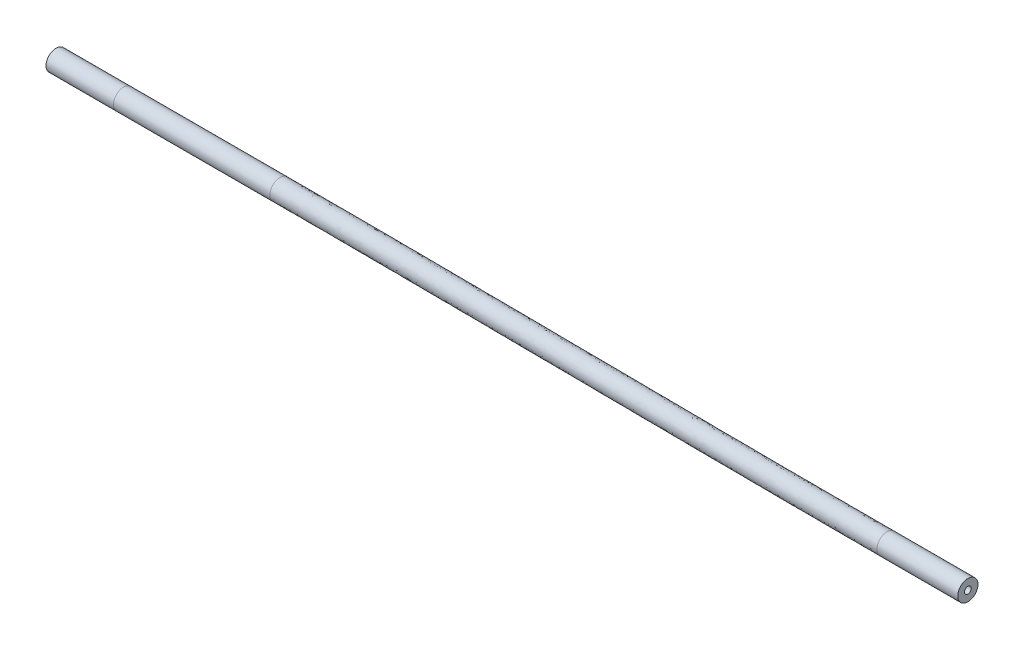
ISO-10303-21;
HEADER;
FILE_DESCRIPTION(('STEP AP214'),'2;1');
FILE_NAME('part.step','',(''),(''),'','','');
FILE_SCHEMA(('AUTOMOTIVE_DESIGN { 1 0 10303 214 1 1 1 1 }'));
ENDSEC;
DATA;
#1=APPLICATION_CONTEXT('core data for automotive mechanical design processes');
#2=APPLICATION_PROTOCOL_DEFINITION('international standard','automotive_design',2000,#1);
#3=PRODUCT_CONTEXT('',#1,'mechanical');
#4=PRODUCT('Part','Part','',(#3));
#5=PRODUCT_RELATED_PRODUCT_CATEGORY('part','',(#4));
#6=PRODUCT_DEFINITION_FORMATION('','',#4);
#7=PRODUCT_DEFINITION_CONTEXT('part definition',#1,'design');
#8=PRODUCT_DEFINITION('design','',#6,#7);
#9=PRODUCT_DEFINITION_SHAPE('','',#8);
#10=(LENGTH_UNIT() NAMED_UNIT(*) SI_UNIT(.MILLI.,.METRE.));
#11=(NAMED_UNIT(*) PLANE_ANGLE_UNIT() SI_UNIT($,.RADIAN.));
#12=(NAMED_UNIT(*) SI_UNIT($,.STERADIAN.) SOLID_ANGLE_UNIT());
#13=UNCERTAINTY_MEASURE_WITH_UNIT(LENGTH_MEASURE(1.E-05),#10,'distance_accuracy_value','');
#14=(GEOMETRIC_REPRESENTATION_CONTEXT(3) GLOBAL_UNCERTAINTY_ASSIGNED_CONTEXT((#13)) GLOBAL_UNIT_ASSIGNED_CONTEXT((#10,
#11,#12)) REPRESENTATION_CONTEXT('',''));
#15=CARTESIAN_POINT('',(0.,0.,0.));
#16=DIRECTION('',(0.,0.,1.));
#17=DIRECTION('',(1.,0.,0.));
#18=AXIS2_PLACEMENT_3D('',#15,#16,#17);
#19=CARTESIAN_POINT('',(114.,-0.499999999999999,0.));
#20=DIRECTION('',(-1.,0.,0.));
#21=DIRECTION('',(0.,-1.,0.));
#22=AXIS2_PLACEMENT_3D('',#19,#20,#21);
#23=CYLINDRICAL_SURFACE('',#22,1.5);
#24=CARTESIAN_POINT('',(102.,-0.499999999999996,0.));
#25=DIRECTION('',(1.,0.,0.));
#26=DIRECTION('',(0.,0.,-1.));
#27=AXIS2_PLACEMENT_3D('',#24,#25,#26);
#28=CIRCLE('',#27,1.5);
#29=CARTESIAN_POINT('',(102.,-0.499999999999996,-1.5));
#30=VERTEX_POINT('',#29);
#31=EDGE_CURVE('E64',#30,#30,#28,.T.);
#32=ORIENTED_EDGE('',*,*,#31,.T.);
#33=EDGE_LOOP('',(#32));
#34=FACE_BOUND('',#33,.T.);
#35=CARTESIAN_POINT('',(114.,-0.499999999999999,0.));
#36=DIRECTION('',(1.,0.,0.));
#37=DIRECTION('',(0.,0.,-1.));
#38=AXIS2_PLACEMENT_3D('',#35,#36,#37);
#39=CIRCLE('',#38,1.5);
#40=CARTESIAN_POINT('',(114.,-0.499999999999999,-1.5));
#41=VERTEX_POINT('',#40);
#42=EDGE_CURVE('E60',#41,#41,#39,.T.);
#43=ORIENTED_EDGE('',*,*,#42,.F.);
#44=EDGE_LOOP('',(#43));
#45=FACE_BOUND('',#44,.T.);
#46=ADVANCED_FACE('F38',(#34,#45),#23,.T.);
#47=CARTESIAN_POINT('',(102.,-0.499999999999996,-1.5));
#48=CARTESIAN_POINT('',(86.9995138723806,-0.499999999999995,-1.5));
#49=CARTESIAN_POINT('',(71.9996527699958,-0.374999999980908,-1.5));
#50=CARTESIAN_POINT('',(42.0003472300039,-0.125000000019079,-1.5));
#51=CARTESIAN_POINT('',(27.0004861276194,0.,-1.5));
#52=CARTESIAN_POINT('',(12.,0.,-1.5));
#53=CARTESIAN_POINT('',(102.,2.50000000000001,-1.5));
#54=CARTESIAN_POINT('',(87.0078468199204,2.50000000000001,-1.5));
#55=CARTESIAN_POINT('',(72.0246524806557,2.62489583395516,-1.5));
#56=CARTESIAN_POINT('',(42.0253469406638,2.87489583391699,-1.5));
#57=CARTESIAN_POINT('',(27.0088190751592,3.00000000000001,-1.5));
#58=CARTESIAN_POINT('',(12.,3.00000000000001,-1.5));
#59=CARTESIAN_POINT('',(102.,2.50000000000001,1.5));
#60=CARTESIAN_POINT('',(87.0078468199204,2.50000000000001,1.5));
#61=CARTESIAN_POINT('',(72.0246524806557,2.62489583395557,1.5));
#62=CARTESIAN_POINT('',(42.0253469406638,2.87489583391658,1.5));
#63=CARTESIAN_POINT('',(27.0088190751592,3.00000000000001,1.5));
#64=CARTESIAN_POINT('',(12.,3.00000000000001,1.5));
#65=CARTESIAN_POINT('',(102.,-0.499999999999996,1.5));
#66=CARTESIAN_POINT('',(86.9995138723806,-0.499999999999995,1.5));
#67=CARTESIAN_POINT('',(71.9996527699958,-0.374999999980501,1.5));
#68=CARTESIAN_POINT('',(42.0003472300039,-0.125000000019485,1.5));
#69=CARTESIAN_POINT('',(27.0004861276194,0.,1.5));
#70=CARTESIAN_POINT('',(12.,0.,1.5));
#71=CARTESIAN_POINT('',(102.,-3.5,1.5));
#72=CARTESIAN_POINT('',(86.9911809248408,-3.5,1.5));
#73=CARTESIAN_POINT('',(71.9746530593359,-3.37489583391657,1.5));
#74=CARTESIAN_POINT('',(41.975347519344,-3.12489583395555,1.5));
#75=CARTESIAN_POINT('',(26.9921531800796,-3.00000000000001,1.5));
#76=CARTESIAN_POINT('',(12.,-3.00000000000001,1.5));
#77=CARTESIAN_POINT('',(102.,-3.5,-1.5));
#78=CARTESIAN_POINT('',(86.9911809248408,-3.5,-1.5));
#79=CARTESIAN_POINT('',(71.9746530593359,-3.37489583391697,-1.5));
#80=CARTESIAN_POINT('',(41.975347519344,-3.12489583395515,-1.5));
#81=CARTESIAN_POINT('',(26.9921531800796,-3.00000000000001,-1.5));
#82=CARTESIAN_POINT('',(12.,-3.00000000000001,-1.5));
#83=CARTESIAN_POINT('',(102.,-0.499999999999996,-1.5));
#84=CARTESIAN_POINT('',(86.9995138723806,-0.499999999999995,-1.5));
#85=CARTESIAN_POINT('',(71.9996527699958,-0.374999999980908,-1.5));
#86=CARTESIAN_POINT('',(42.0003472300039,-0.125000000019079,-1.5));
#87=CARTESIAN_POINT('',(27.0004861276194,0.,-1.5));
#88=CARTESIAN_POINT('',(12.,0.,-1.5));
#89=(BOUNDED_SURFACE() B_SPLINE_SURFACE(3,3,((#47,#48,#49,#50,#51,#52),(#53,#54,#55,#56,#57,
#58),(#59,#60,#61,#62,#63,#64),(#65,#66,#67,#68,#69,#70),(#71,#72,#73,#74,#75,#76),(#77,#78,#79,
#80,#81,#82),(#83,#84,#85,#86,#87,#88)),.UNSPECIFIED.,.T.,.F.,
.F.) B_SPLINE_SURFACE_WITH_KNOTS((4,3,4),(4,2,4),(0.,0.5,1.),(0.088756302247101,
0.421598599681728,0.754440897116355),
.UNSPECIFIED.) GEOMETRIC_REPRESENTATION_ITEM() RATIONAL_B_SPLINE_SURFACE(((1.,1.,1.,1.,1.,1.),
(0.333333333333333,0.333333333333333,0.333333333333333,0.333333333333333,0.333333333333333,
0.333333333333333),(0.333333333333333,0.333333333333333,0.333333333333333,0.333333333333333,
0.333333333333333,0.333333333333333),(1.,1.,1.,1.,1.,1.),(0.333333333333333,0.333333333333333,
0.333333333333333,0.333333333333333,0.333333333333333,0.333333333333333),(0.333333333333333,
0.333333333333333,0.333333333333333,0.333333333333333,0.333333333333333,0.333333333333333),(1.,
1.,1.,1.,1.,1.))) REPRESENTATION_ITEM('') SURFACE());
#90=CARTESIAN_POINT('',(12.,0.,0.));
#91=DIRECTION('',(1.,0.,0.));
#92=DIRECTION('',(0.,0.,-1.));
#93=AXIS2_PLACEMENT_3D('',#90,#91,#92);
#94=CIRCLE('',#93,1.5);
#95=CARTESIAN_POINT('',(12.,0.,-1.5));
#96=VERTEX_POINT('',#95);
#97=EDGE_CURVE('E61',#96,#96,#94,.T.);
#98=CARTESIAN_POINT('',(12.,0.,-1.5));
#99=CARTESIAN_POINT('',(12.9375281718332,9.66908971677786E-10,-1.5));
#100=CARTESIAN_POINT('',(13.8750562774701,-0.000488278927976679,-1.5));
#101=CARTESIAN_POINT('',(15.7501078091922,-0.00238036961634652,-1.5));
#102=CARTESIAN_POINT('',(16.6876312352812,-0.00378417673254461,-1.5));
#103=CARTESIAN_POINT('',(18.5626735755728,-0.00744628651826532,-1.5));
#104=CARTESIAN_POINT('',(19.5001924897805,-0.00970458662074905,-1.5));
#105=CARTESIAN_POINT('',(21.3752260218824,-0.0150146459030774,-1.5));
#106=CARTESIAN_POINT('',(22.3127406397814,-0.0180664033613219,-1.5));
#107=CARTESIAN_POINT('',(24.1877657820036,-0.0249023415150378,-1.5));
#108=CARTESIAN_POINT('',(25.1252763063309,-0.028686521111428,-1.5));
#109=CARTESIAN_POINT('',(27.0002934675876,-0.0369262678108394,-1.5));
#110=CARTESIAN_POINT('',(27.93780010452,-0.0413818342531771,-1.5));
#111=CARTESIAN_POINT('',(29.8128096962432,-0.0509033191153537,-1.5));
#112=CARTESIAN_POINT('',(30.7503126510361,-0.0559692371644817,-1.5));
#113=CARTESIAN_POINT('',(32.6253150839835,-0.0666503898430166,-1.5));
#114=CARTESIAN_POINT('',(33.5628145621393,-0.0722656242758549,-1.5));
#115=CARTESIAN_POINT('',(35.4378102472496,-0.0839843744332726,-1.5));
#116=CARTESIAN_POINT('',(36.3753064542047,-0.0900878900490866,-1.5));
#117=CARTESIAN_POINT('',(38.2502958023677,-0.102722167364138,-1.5));
#118=CARTESIAN_POINT('',(39.1877889435762,-0.109252928982462,-1.5));
#119=CARTESIAN_POINT('',(41.0627723656951,-0.122680663139223,-1.5));
#120=CARTESIAN_POINT('',(42.0002626466061,-0.129577635587928,-1.5));
#121=CARTESIAN_POINT('',(43.8752405535802,-0.1436767563028,-1.5));
#122=CARTESIAN_POINT('',(44.8127281796441,-0.150878904453925,-1.5));
#123=CARTESIAN_POINT('',(46.6877009823743,-0.165527341369215,-1.5));
#124=CARTESIAN_POINT('',(47.6251861590416,-0.172973629993612,-1.5));
#125=CARTESIAN_POINT('',(49.5001542684259,-0.188049313066894,-1.5));
#126=CARTESIAN_POINT('',(50.4376372011439,-0.195678707365836,-1.5));
#127=CARTESIAN_POINT('',(52.3126010280898,-0.211059565409626,-1.5));
#128=CARTESIAN_POINT('',(53.2500819223187,-0.218811029019776,-1.5));
#129=CARTESIAN_POINT('',(55.1250418776979,-0.234374995144138,-1.5));
#130=CARTESIAN_POINT('',(56.0625209388489,-0.242187497572066,-1.5));
#131=CARTESIAN_POINT('',(57.9374790611508,-0.257812502427921,-1.5));
#132=CARTESIAN_POINT('',(58.8749581223018,-0.265625004855848,-1.5));
#133=CARTESIAN_POINT('',(60.749918077681,-0.281188970980211,-1.5));
#134=CARTESIAN_POINT('',(61.6873989719099,-0.288940434590361,-1.5));
#135=CARTESIAN_POINT('',(63.5623627988558,-0.304321292634152,-1.5));
#136=CARTESIAN_POINT('',(64.4998457315739,-0.311950686933093,-1.5));
#137=CARTESIAN_POINT('',(66.3748138409581,-0.327026370006375,-1.5));
#138=CARTESIAN_POINT('',(67.3122990176255,-0.334472658630773,-1.5));
#139=CARTESIAN_POINT('',(69.1872718203557,-0.349121095546064,-1.5));
#140=CARTESIAN_POINT('',(70.1247594464195,-0.356323243697189,-1.5));
#141=CARTESIAN_POINT('',(71.9997373533937,-0.370422364412061,-1.5));
#142=CARTESIAN_POINT('',(72.9372276343047,-0.377319336860766,-1.5));
#143=CARTESIAN_POINT('',(74.8122110564236,-0.390747071017528,-1.5));
#144=CARTESIAN_POINT('',(75.7497041976321,-0.397277832635852,-1.5));
#145=CARTESIAN_POINT('',(77.6246935457952,-0.409912109950904,-1.5));
#146=CARTESIAN_POINT('',(78.5621897527503,-0.416015625566719,-1.5));
#147=CARTESIAN_POINT('',(80.4371854378605,-0.427734375724137,-1.5));
#148=CARTESIAN_POINT('',(81.3746849160163,-0.433349610156975,-1.5));
#149=CARTESIAN_POINT('',(83.2496873489638,-0.444030762835511,-1.5));
#150=CARTESIAN_POINT('',(84.1871903037567,-0.449096680884639,-1.5));
#151=CARTESIAN_POINT('',(86.06219989548,-0.458618165746817,-1.5));
#152=CARTESIAN_POINT('',(86.9997065324123,-0.463073732189154,-1.5));
#153=CARTESIAN_POINT('',(88.874723693669,-0.471313478888567,-1.5));
#154=CARTESIAN_POINT('',(89.8122342179963,-0.475097658484957,-1.5));
#155=CARTESIAN_POINT('',(91.6872593602186,-0.481933596638673,-1.5));
#156=CARTESIAN_POINT('',(92.6247739781176,-0.484985354096918,-1.5));
#157=CARTESIAN_POINT('',(94.4998075102194,-0.490295413379247,-1.5));
#158=CARTESIAN_POINT('',(95.4373264244272,-0.492553713481731,-1.5));
#159=CARTESIAN_POINT('',(97.3123687647188,-0.496215823267452,-1.5));
#160=CARTESIAN_POINT('',(98.2498921908078,-0.49761963038365,-1.5));
#161=CARTESIAN_POINT('',(100.12494372253,-0.49951172107202,-1.5));
#162=CARTESIAN_POINT('',(101.062471828167,-0.500000000966906,-1.5));
#163=CARTESIAN_POINT('',(102.,-0.499999999999996,-1.5));
#164=B_SPLINE_CURVE_WITH_KNOTS('',3,(#98,#99,#100,#101,#102,#103,#104,#105,#106,#107,#108,#109,
#110,#111,#112,#113,#114,#115,#116,#117,#118,#119,#120,#121,#122,#123,#124,#125,#126,#127,#128,
#129,#130,#131,#132,#133,#134,#135,#136,#137,#138,#139,#140,#141,#142,#143,#144,#145,#146,#147,
#148,#149,#150,#151,#152,#153,#154,#155,#156,#157,#158,#159,#160,#161,#162,#163),.UNSPECIFIED.,
.F.,.F.,(4,2,2,2,2,2,2,2,2,2,2,2,2,2,2,2,2,2,2,2,2,2,2,2,2,2,2,2,2,2,2,2,4),(0.,
2.81258429187561,5.62515728685783,8.4377218324706,11.2502802755861,14.0628344981763,
16.8753859530682,19.6879356997016,22.5004844398898,25.3130325535802,28.1255801346169,
30.9381270265026,33.7506728581613,36.5632170797,39.3757589981712,42.1882978133345,
45.000832653418,47.8133674935015,50.6259063086648,53.438448227136,56.2509924486748,
59.0635382803334,61.8760851722192,64.6886327532559,67.5011808669463,70.3137296071345,
73.126279353768,75.9388308086599,78.7513850312501,81.5639434743656,84.3765080199784,
87.1890810149607,90.0016653068362),.UNSPECIFIED.);
#165=EDGE_CURVE('BSEAM115',#96,#30,#164,.T.);
#166=ORIENTED_EDGE('',*,*,#97,.T.);
#167=ORIENTED_EDGE('',*,*,#31,.F.);
#168=ORIENTED_EDGE('',*,*,#165,.T.);
#169=ORIENTED_EDGE('',*,*,#165,.F.);
#170=EDGE_LOOP('',(#166,#168,#167,#169));
#171=FACE_BOUND('',#170,.T.);
#172=ADVANCED_FACE('F115',(#171),#89,.F.);
#173=CARTESIAN_POINT('',(12.,0.,0.));
#174=DIRECTION('',(-1.,0.,0.));
#175=DIRECTION('',(0.,0.,1.));
#176=AXIS2_PLACEMENT_3D('',#173,#174,#175);
#177=CYLINDRICAL_SURFACE('',#176,1.5);
#178=CARTESIAN_POINT('',(-11.2,0.,0.));
#179=DIRECTION('',(1.,0.,0.));
#180=DIRECTION('',(0.,0.,-1.));
#181=AXIS2_PLACEMENT_3D('',#178,#179,#180);
#182=CIRCLE('',#181,1.5);
#183=CARTESIAN_POINT('',(-11.2,0.,-1.5));
#184=VERTEX_POINT('',#183);
#185=EDGE_CURVE('E57',#184,#184,#182,.T.);
#186=ORIENTED_EDGE('',*,*,#185,.T.);
#187=EDGE_LOOP('',(#186));
#188=FACE_BOUND('',#187,.T.);
#189=ORIENTED_EDGE('',*,*,#97,.F.);
#190=EDGE_LOOP('',(#189));
#191=FACE_BOUND('',#190,.T.);
#192=ADVANCED_FACE('F121',(#188,#191),#177,.T.);
#193=CARTESIAN_POINT('',(-11.2,0.,0.));
#194=DIRECTION('',(-1.,0.,0.));
#195=DIRECTION('',(0.,-1.,0.));
#196=AXIS2_PLACEMENT_3D('',#193,#194,#195);
#197=CYLINDRICAL_SURFACE('',#196,1.5);
#198=CARTESIAN_POINT('',(-21.2,0.,0.));
#199=DIRECTION('',(1.,0.,0.));
#200=DIRECTION('',(0.,0.,-1.));
#201=AXIS2_PLACEMENT_3D('',#198,#199,#200);
#202=CIRCLE('',#201,1.5);
#203=CARTESIAN_POINT('',(-21.2,0.,-1.5));
#204=VERTEX_POINT('',#203);
#205=EDGE_CURVE('E69',#204,#204,#202,.T.);
#206=ORIENTED_EDGE('',*,*,#205,.T.);
#207=EDGE_LOOP('',(#206));
#208=FACE_BOUND('',#207,.T.);
#209=ORIENTED_EDGE('',*,*,#185,.F.);
#210=EDGE_LOOP('',(#209));
#211=FACE_BOUND('',#210,.T.);
#212=ADVANCED_FACE('F112',(#208,#211),#197,.T.);
#213=CARTESIAN_POINT('',(114.,-0.499999999999999,0.));
#214=DIRECTION('',(1.,0.,0.));
#215=DIRECTION('',(0.,0.,-1.));
#216=AXIS2_PLACEMENT_3D('',#213,#214,#215);
#217=PLANE('',#216);
#218=CARTESIAN_POINT('',(114.,-0.499999999999999,0.));
#219=DIRECTION('',(1.,0.,0.));
#220=DIRECTION('',(0.,0.,-1.));
#221=AXIS2_PLACEMENT_3D('',#218,#219,#220);
#222=CIRCLE('',#221,0.5);
#223=CARTESIAN_POINT('',(114.,-0.499999999999999,-0.5));
#224=VERTEX_POINT('',#223);
#225=EDGE_CURVE('E71',#224,#224,#222,.F.);
#226=ORIENTED_EDGE('',*,*,#225,.T.);
#227=EDGE_LOOP('',(#226));
#228=FACE_BOUND('',#227,.T.);
#229=ORIENTED_EDGE('',*,*,#42,.T.);
#230=EDGE_LOOP('',(#229));
#231=FACE_BOUND('',#230,.T.);
#232=ADVANCED_FACE('F81',(#228,#231),#217,.T.);
#233=CARTESIAN_POINT('',(-21.2,0.,0.));
#234=DIRECTION('',(1.,0.,0.));
#235=DIRECTION('',(0.,0.,-1.));
#236=AXIS2_PLACEMENT_3D('',#233,#234,#235);
#237=PLANE('',#236);
#238=CARTESIAN_POINT('',(-21.2,0.,0.));
#239=DIRECTION('',(1.,0.,0.));
#240=DIRECTION('',(0.,0.,-1.));
#241=AXIS2_PLACEMENT_3D('',#238,#239,#240);
#242=CIRCLE('',#241,1.30000000000001);
#243=CARTESIAN_POINT('',(-21.2,-1.30000000000001,0.));
#244=VERTEX_POINT('',#243);
#245=EDGE_CURVE('E10',#244,#244,#242,.T.);
#246=ORIENTED_EDGE('',*,*,#245,.T.);
#247=EDGE_LOOP('',(#246));
#248=FACE_BOUND('',#247,.T.);
#249=ORIENTED_EDGE('',*,*,#205,.F.);
#250=EDGE_LOOP('',(#249));
#251=FACE_BOUND('',#250,.T.);
#252=ADVANCED_FACE('F87',(#248,#251),#237,.F.);
#253=CARTESIAN_POINT('',(114.,-0.499999999999999,0.));
#254=DIRECTION('',(-1.,0.,0.));
#255=DIRECTION('',(0.,-1.,0.));
#256=AXIS2_PLACEMENT_3D('',#253,#254,#255);
#257=CYLINDRICAL_SURFACE('',#256,0.5);
#258=CARTESIAN_POINT('',(102.,-0.499999999999996,0.));
#259=DIRECTION('',(1.,0.,0.));
#260=DIRECTION('',(0.,0.,-1.));
#261=AXIS2_PLACEMENT_3D('',#258,#259,#260);
#262=CIRCLE('',#261,0.5);
#263=CARTESIAN_POINT('',(102.,-0.499999999999996,-0.5));
#264=VERTEX_POINT('',#263);
#265=EDGE_CURVE('E75',#264,#264,#262,.F.);
#266=ORIENTED_EDGE('',*,*,#265,.T.);
#267=EDGE_LOOP('',(#266));
#268=FACE_BOUND('',#267,.T.);
#269=ORIENTED_EDGE('',*,*,#225,.F.);
#270=EDGE_LOOP('',(#269));
#271=FACE_BOUND('',#270,.T.);
#272=ADVANCED_FACE('F84',(#268,#271),#257,.F.);
#273=CARTESIAN_POINT('',(102.,-0.499999999999996,-0.5));
#274=CARTESIAN_POINT('',(71.9990277447612,-0.499999999999994,-0.5));
#275=CARTESIAN_POINT('',(42.0009722552388,0.,-0.5));
#276=CARTESIAN_POINT('',(12.,0.,-0.5));
#277=CARTESIAN_POINT('',(102.,-1.5,-0.5));
#278=CARTESIAN_POINT('',(71.9934724464014,-1.49999999999999,-0.5));
#279=CARTESIAN_POINT('',(41.9954169568789,-1.,-0.5));
#280=CARTESIAN_POINT('',(12.,-1.,-0.5));
#281=CARTESIAN_POINT('',(102.,-1.5,0.5));
#282=CARTESIAN_POINT('',(71.9934724464014,-1.49999999999999,0.5));
#283=CARTESIAN_POINT('',(41.9954169568789,-1.,0.5));
#284=CARTESIAN_POINT('',(12.,-1.,0.5));
#285=CARTESIAN_POINT('',(102.,-0.499999999999996,0.5));
#286=CARTESIAN_POINT('',(71.9990277447612,-0.499999999999993,0.5));
#287=CARTESIAN_POINT('',(42.0009722552388,0.,0.5));
#288=CARTESIAN_POINT('',(12.,0.,0.5));
#289=CARTESIAN_POINT('',(102.,0.500000000000004,0.5));
#290=CARTESIAN_POINT('',(72.0045830431211,0.500000000000006,0.5));
#291=CARTESIAN_POINT('',(42.0065275535986,0.999999999999999,0.5));
#292=CARTESIAN_POINT('',(12.,0.999999999999999,0.5));
#293=CARTESIAN_POINT('',(102.,0.500000000000004,-0.5));
#294=CARTESIAN_POINT('',(72.0045830431211,0.500000000000006,-0.5));
#295=CARTESIAN_POINT('',(42.0065275535986,0.999999999999999,-0.5));
#296=CARTESIAN_POINT('',(12.,0.999999999999999,-0.5));
#297=CARTESIAN_POINT('',(102.,-0.499999999999996,-0.5));
#298=CARTESIAN_POINT('',(71.9990277447612,-0.499999999999994,-0.5));
#299=CARTESIAN_POINT('',(42.0009722552388,0.,-0.5));
#300=CARTESIAN_POINT('',(12.,0.,-0.5));
#301=(BOUNDED_SURFACE() B_SPLINE_SURFACE(3,3,((#273,#274,#275,#276),(#277,#278,#279,#280),(#281,
#282,#283,#284),(#285,#286,#287,#288),(#289,#290,#291,#292),(#293,#294,#295,#296),(#297,#298,
#299,#300)),.UNSPECIFIED.,.T.,.F.,.F.) B_SPLINE_SURFACE_WITH_KNOTS((4,3,4),(4,4),(0.,0.5,1.),
(0.088756302247101,0.754440897116355),
.UNSPECIFIED.) GEOMETRIC_REPRESENTATION_ITEM() RATIONAL_B_SPLINE_SURFACE(((1.,1.,1.,1.),
(0.333333333333333,0.333333333333333,0.333333333333333,0.333333333333333),(0.333333333333333,
0.333333333333333,0.333333333333333,0.333333333333333),(1.,1.,1.,1.),(0.333333333333333,
0.333333333333333,0.333333333333333,0.333333333333333),(0.333333333333333,0.333333333333333,
0.333333333333333,0.333333333333333),(1.,1.,1.,1.))) REPRESENTATION_ITEM('') SURFACE());
#302=CARTESIAN_POINT('',(12.,0.,0.));
#303=DIRECTION('',(1.,0.,0.));
#304=DIRECTION('',(0.,0.,-1.));
#305=AXIS2_PLACEMENT_3D('',#302,#303,#304);
#306=CIRCLE('',#305,0.5);
#307=CARTESIAN_POINT('',(12.,0.,-0.5));
#308=VERTEX_POINT('',#307);
#309=EDGE_CURVE('E54',#308,#308,#306,.F.);
#310=CARTESIAN_POINT('',(12.,0.,-0.5));
#311=CARTESIAN_POINT('',(12.9375277903645,1.12084924024294E-09,-0.5));
#312=CARTESIAN_POINT('',(13.8750555145343,-0.000488278528079691,-0.5));
#313=CARTESIAN_POINT('',(15.7501056221102,-0.0023803693486022,-0.5));
#314=CARTESIAN_POINT('',(16.6876280055207,-0.00378417619720582,-0.5));
#315=CARTESIAN_POINT('',(18.5626677518305,-0.00744628605865432,-0.5));
#316=CARTESIAN_POINT('',(19.5001851147359,-0.00970458604087341,-0.5));
#317=CARTESIAN_POINT('',(21.375215188195,-0.0150146454714009,-0.5));
#318=CARTESIAN_POINT('',(22.3127278987545,-0.0180664028967783,-0.5));
#319=CARTESIAN_POINT('',(24.1877490228472,-0.0249023412324999,-0.5));
#320=CARTESIAN_POINT('',(25.1252574363849,-0.0286865208848214,-0.5));
#321=CARTESIAN_POINT('',(27.0002703251993,-0.03692626780627,-0.5));
#322=CARTESIAN_POINT('',(27.9377748004791,-0.0413818343782925,-0.5));
#323=CARTESIAN_POINT('',(29.8127801706218,-0.0509033194967627,-0.5));
#324=CARTESIAN_POINT('',(30.7502810654862,-0.0559692377387291,-0.5));
#325=CARTESIAN_POINT('',(32.6252796328891,-0.0666503907051491,-0.5));
#326=CARTESIAN_POINT('',(33.5627773054279,-0.0722656253820444,-0.5));
#327=CARTESIAN_POINT('',(35.437769786204,-0.0839843758558361,-0.5));
#328=CARTESIAN_POINT('',(36.3752645944407,-0.090087891755889,-0.5));
#329=CARTESIAN_POINT('',(38.2502517046546,-0.102722169411344,-0.5));
#330=CARTESIAN_POINT('',(39.1877440066307,-0.109252931340798,-0.5));
#331=CARTESIAN_POINT('',(41.06272646236,-0.122680665863401,-0.5));
#332=CARTESIAN_POINT('',(42.0002166161119,-0.129577638644961,-0.5));
#333=CARTESIAN_POINT('',(43.8751951334306,-0.143676759730408,-0.5));
#334=CARTESIAN_POINT('',(44.8126834969962,-0.150878908200705,-0.5));
#335=CARTESIAN_POINT('',(46.6876587919794,-0.165527345553195,-0.5));
#336=CARTESIAN_POINT('',(47.6251457233959,-0.172973634560516,-0.5));
#337=CARTESIAN_POINT('',(49.5001185121181,-0.188049317891242,-0.5));
#338=CARTESIAN_POINT('',(50.437604369423,-0.195678712293181,-0.5));
#339=CARTESIAN_POINT('',(52.3125753679588,-0.211059571318766,-0.5));
#340=CARTESIAN_POINT('',(53.2500605091893,-0.218811035979903,-0.5));
#341=CARTESIAN_POINT('',(55.1250304336133,-0.234375000420853,-0.5));
#342=CARTESIAN_POINT('',(56.0625152168066,-0.242187500210425,-0.5));
#343=CARTESIAN_POINT('',(57.9374847831934,-0.25781249978957,-0.5));
#344=CARTESIAN_POINT('',(58.8749695663867,-0.265624999579143,-0.5));
#345=CARTESIAN_POINT('',(60.7499394908107,-0.281188964020092,-0.5));
#346=CARTESIAN_POINT('',(61.6874246320412,-0.288940428681229,-0.5));
#347=CARTESIAN_POINT('',(63.562395630577,-0.304321287706815,-0.5));
#348=CARTESIAN_POINT('',(64.4998814878819,-0.311950682108754,-0.5));
#349=CARTESIAN_POINT('',(66.3748542766041,-0.32702636543948,-0.5));
#350=CARTESIAN_POINT('',(67.3123412080206,-0.3344726544468,-0.5));
#351=CARTESIAN_POINT('',(69.1873165030038,-0.34912109179929,-0.5));
#352=CARTESIAN_POINT('',(70.1248048665693,-0.356323240269588,-0.5));
#353=CARTESIAN_POINT('',(71.9997833838881,-0.370422361355035,-0.5));
#354=CARTESIAN_POINT('',(72.93727353764,-0.377319334136594,-0.5));
#355=CARTESIAN_POINT('',(74.8122559933693,-0.390747068659198,-0.5));
#356=CARTESIAN_POINT('',(75.7497482953454,-0.397277830588652,-0.5));
#357=CARTESIAN_POINT('',(77.6247354055593,-0.409912108244107,-0.5));
#358=CARTESIAN_POINT('',(78.562230213796,-0.41601562414416,-0.5));
#359=CARTESIAN_POINT('',(80.4372226945722,-0.427734374617951,-0.5));
#360=CARTESIAN_POINT('',(81.3747203671109,-0.433349609294847,-0.5));
#361=CARTESIAN_POINT('',(83.2497189345138,-0.444030762261267,-0.5));
#362=CARTESIAN_POINT('',(84.1872198293782,-0.449096680503233,-0.5));
#363=CARTESIAN_POINT('',(86.0622251995209,-0.458618165621704,-0.5));
#364=CARTESIAN_POINT('',(86.9997296748007,-0.463073732193726,-0.5));
#365=CARTESIAN_POINT('',(88.8747425636151,-0.471313479115175,-0.5));
#366=CARTESIAN_POINT('',(89.8122509771528,-0.475097658767497,-0.5));
#367=CARTESIAN_POINT('',(91.6872721012455,-0.481933597103218,-0.5));
#368=CARTESIAN_POINT('',(92.624784811805,-0.484985354528596,-0.5));
#369=CARTESIAN_POINT('',(94.4998148852642,-0.490295413959123,-0.5));
#370=CARTESIAN_POINT('',(95.4373322481696,-0.492553713941343,-0.5));
#371=CARTESIAN_POINT('',(97.3123719944793,-0.496215823802791,-0.5));
#372=CARTESIAN_POINT('',(98.2498943778898,-0.497619630651395,-0.5));
#373=CARTESIAN_POINT('',(100.124944485466,-0.499511721471917,-0.5));
#374=CARTESIAN_POINT('',(101.062472209635,-0.500000001120847,-0.5));
#375=CARTESIAN_POINT('',(102.,-0.499999999999996,-0.5));
#376=B_SPLINE_CURVE_WITH_KNOTS('',3,(#310,#311,#312,#313,#314,#315,#316,#317,#318,#319,#320,
#321,#322,#323,#324,#325,#326,#327,#328,#329,#330,#331,#332,#333,#334,#335,#336,#337,#338,#339,
#340,#341,#342,#343,#344,#345,#346,#347,#348,#349,#350,#351,#352,#353,#354,#355,#356,#357,#358,
#359,#360,#361,#362,#363,#364,#365,#366,#367,#368,#369,#370,#371,#372,#373,#374,#375),
.UNSPECIFIED.,.F.,.F.,(4,2,2,2,2,2,2,2,2,2,2,2,2,2,2,2,2,2,2,2,2,2,2,2,2,2,2,2,2,2,2,2,4),(0.,
2.81258314747177,5.62515301441988,8.43771290613646,11.2502656272622,14.0628135175349,
16.8753584875438,19.6879020544855,22.500445377925,25.3129892955561,28.1255343589649,
30.9380808693929,33.7506289135008,36.5631783991323,39.3757290910777,42.1882806468378,
45.0008326523867,47.8133846579356,50.6259362136956,53.4384869056411,56.2510363912726,
59.0635844353805,61.8761309458085,64.6886760092173,67.5012199268484,70.3137632502878,
73.1263068172296,75.9388517872384,78.7513996775112,81.5639523986369,84.3765122903535,
87.1890821573016,90.0016653047734),.UNSPECIFIED.);
#377=EDGE_CURVE('BSEAM86',#308,#264,#376,.T.);
#378=ORIENTED_EDGE('',*,*,#309,.T.);
#379=ORIENTED_EDGE('',*,*,#265,.F.);
#380=ORIENTED_EDGE('',*,*,#377,.T.);
#381=ORIENTED_EDGE('',*,*,#377,.F.);
#382=EDGE_LOOP('',(#378,#380,#379,#381));
#383=FACE_BOUND('',#382,.T.);
#384=ADVANCED_FACE('F86',(#383),#301,.F.);
#385=CARTESIAN_POINT('',(12.,0.,0.));
#386=DIRECTION('',(-1.,0.,0.));
#387=DIRECTION('',(0.,0.,1.));
#388=AXIS2_PLACEMENT_3D('',#385,#386,#387);
#389=CYLINDRICAL_SURFACE('',#388,0.5);
#390=CARTESIAN_POINT('',(-11.2,0.,0.));
#391=DIRECTION('',(1.,0.,0.));
#392=DIRECTION('',(0.,0.,-1.));
#393=AXIS2_PLACEMENT_3D('',#390,#391,#392);
#394=CIRCLE('',#393,0.5);
#395=CARTESIAN_POINT('',(-11.2,0.,-0.5));
#396=VERTEX_POINT('',#395);
#397=EDGE_CURVE('E50',#396,#396,#394,.F.);
#398=ORIENTED_EDGE('',*,*,#397,.T.);
#399=EDGE_LOOP('',(#398));
#400=FACE_BOUND('',#399,.T.);
#401=ORIENTED_EDGE('',*,*,#309,.F.);
#402=EDGE_LOOP('',(#401));
#403=FACE_BOUND('',#402,.T.);
#404=ADVANCED_FACE('F94',(#400,#403),#389,.F.);
#405=CARTESIAN_POINT('',(-11.2,0.,0.));
#406=DIRECTION('',(-1.,0.,0.));
#407=DIRECTION('',(0.,-1.,0.));
#408=AXIS2_PLACEMENT_3D('',#405,#406,#407);
#409=CYLINDRICAL_SURFACE('',#408,0.5);
#410=CARTESIAN_POINT('',(-20.4,0.,0.));
#411=DIRECTION('',(1.,0.,0.));
#412=DIRECTION('',(0.,1.,0.));
#413=AXIS2_PLACEMENT_3D('',#410,#411,#412);
#414=CIRCLE('',#413,0.5);
#415=CARTESIAN_POINT('',(-20.4,-0.499999999999998,0.));
#416=VERTEX_POINT('',#415);
#417=EDGE_CURVE('E46',#416,#416,#414,.F.);
#418=ORIENTED_EDGE('',*,*,#417,.T.);
#419=EDGE_LOOP('',(#418));
#420=FACE_BOUND('',#419,.T.);
#421=ORIENTED_EDGE('',*,*,#397,.F.);
#422=EDGE_LOOP('',(#421));
#423=FACE_BOUND('',#422,.T.);
#424=ADVANCED_FACE('F98',(#420,#423),#409,.F.);
#425=CARTESIAN_POINT('',(-20.4,0.,0.));
#426=DIRECTION('',(-1.,0.,0.));
#427=DIRECTION('',(0.,-1.,0.));
#428=AXIS2_PLACEMENT_3D('',#425,#426,#427);
#429=CONICAL_SURFACE('',#428,0.5,0.785398163397455);
#430=CARTESIAN_POINT('',(-21.2,-1.30000000000001,0.));
#431=CARTESIAN_POINT('',(-21.1916666666667,-1.29166666666668,0.));
#432=CARTESIAN_POINT('',(-21.1833333333333,-1.28333333333334,0.));
#433=CARTESIAN_POINT('',(-21.1666666666667,-1.26666666666668,0.));
#434=CARTESIAN_POINT('',(-21.1583333333333,-1.25833333333334,0.));
#435=CARTESIAN_POINT('',(-21.1416666666667,-1.24166666666668,0.));
#436=CARTESIAN_POINT('',(-21.1333333333333,-1.23333333333334,0.));
#437=CARTESIAN_POINT('',(-21.1166666666667,-1.21666666666668,0.));
#438=CARTESIAN_POINT('',(-21.1083333333333,-1.20833333333334,0.));
#439=CARTESIAN_POINT('',(-21.0916666666667,-1.19166666666668,0.));
#440=CARTESIAN_POINT('',(-21.0833333333333,-1.18333333333334,0.));
#441=CARTESIAN_POINT('',(-21.0666666666667,-1.16666666666668,0.));
#442=CARTESIAN_POINT('',(-21.0583333333333,-1.15833333333334,0.));
#443=CARTESIAN_POINT('',(-21.0416666666667,-1.14166666666668,0.));
#444=CARTESIAN_POINT('',(-21.0333333333333,-1.13333333333334,0.));
#445=CARTESIAN_POINT('',(-21.0166666666667,-1.11666666666668,0.));
#446=CARTESIAN_POINT('',(-21.0083333333333,-1.10833333333334,0.));
#447=CARTESIAN_POINT('',(-20.9916666666667,-1.09166666666667,0.));
#448=CARTESIAN_POINT('',(-20.9833333333333,-1.08333333333334,0.));
#449=CARTESIAN_POINT('',(-20.9666666666667,-1.06666666666667,0.));
#450=CARTESIAN_POINT('',(-20.9583333333333,-1.05833333333334,0.));
#451=CARTESIAN_POINT('',(-20.9416666666667,-1.04166666666667,0.));
#452=CARTESIAN_POINT('',(-20.9333333333333,-1.03333333333334,0.));
#453=CARTESIAN_POINT('',(-20.9166666666667,-1.01666666666667,0.));
#454=CARTESIAN_POINT('',(-20.9083333333333,-1.00833333333334,0.));
#455=CARTESIAN_POINT('',(-20.8916666666667,-0.991666666666673,0.));
#456=CARTESIAN_POINT('',(-20.8833333333333,-0.983333333333339,0.));
#457=CARTESIAN_POINT('',(-20.8666666666667,-0.966666666666673,0.));
#458=CARTESIAN_POINT('',(-20.8583333333333,-0.958333333333339,0.));
#459=CARTESIAN_POINT('',(-20.8416666666667,-0.941666666666672,0.));
#460=CARTESIAN_POINT('',(-20.8333333333333,-0.933333333333338,0.));
#461=CARTESIAN_POINT('',(-20.8166666666667,-0.916666666666672,0.));
#462=CARTESIAN_POINT('',(-20.8083333333333,-0.908333333333338,0.));
#463=CARTESIAN_POINT('',(-20.7916666666667,-0.891666666666671,0.));
#464=CARTESIAN_POINT('',(-20.7833333333333,-0.883333333333338,0.));
#465=CARTESIAN_POINT('',(-20.7666666666667,-0.86666666666667,0.));
#466=CARTESIAN_POINT('',(-20.7583333333333,-0.858333333333337,0.));
#467=CARTESIAN_POINT('',(-20.7416666666667,-0.84166666666667,0.));
#468=CARTESIAN_POINT('',(-20.7333333333333,-0.833333333333337,0.));
#469=CARTESIAN_POINT('',(-20.7166666666667,-0.81666666666667,0.));
#470=CARTESIAN_POINT('',(-20.7083333333333,-0.808333333333336,0.));
#471=CARTESIAN_POINT('',(-20.6916666666667,-0.79166666666667,0.));
#472=CARTESIAN_POINT('',(-20.6833333333333,-0.783333333333336,0.));
#473=CARTESIAN_POINT('',(-20.6666666666667,-0.766666666666669,0.));
#474=CARTESIAN_POINT('',(-20.6583333333333,-0.758333333333335,0.));
#475=CARTESIAN_POINT('',(-20.6416666666667,-0.741666666666668,0.));
#476=CARTESIAN_POINT('',(-20.6333333333333,-0.733333333333335,0.));
#477=CARTESIAN_POINT('',(-20.6166666666667,-0.716666666666668,0.));
#478=CARTESIAN_POINT('',(-20.6083333333333,-0.708333333333335,0.));
#479=CARTESIAN_POINT('',(-20.5916666666667,-0.691666666666668,0.));
#480=CARTESIAN_POINT('',(-20.5833333333333,-0.683333333333334,0.));
#481=CARTESIAN_POINT('',(-20.5666666666667,-0.666666666666668,0.));
#482=CARTESIAN_POINT('',(-20.5583333333333,-0.658333333333334,0.));
#483=CARTESIAN_POINT('',(-20.5416666666667,-0.641666666666667,0.));
#484=CARTESIAN_POINT('',(-20.5333333333333,-0.633333333333334,0.));
#485=CARTESIAN_POINT('',(-20.5166666666667,-0.616666666666666,0.));
#486=CARTESIAN_POINT('',(-20.5083333333333,-0.608333333333333,0.));
#487=CARTESIAN_POINT('',(-20.4916666666667,-0.591666666666666,0.));
#488=CARTESIAN_POINT('',(-20.4833333333333,-0.583333333333333,0.));
#489=CARTESIAN_POINT('',(-20.4666666666667,-0.566666666666666,0.));
#490=CARTESIAN_POINT('',(-20.4583333333333,-0.558333333333332,0.));
#491=CARTESIAN_POINT('',(-20.4416666666667,-0.541666666666666,0.));
#492=CARTESIAN_POINT('',(-20.4333333333333,-0.533333333333332,0.));
#493=CARTESIAN_POINT('',(-20.4166666666667,-0.516666666666665,0.));
#494=CARTESIAN_POINT('',(-20.4083333333333,-0.508333333333332,0.));
#495=CARTESIAN_POINT('',(-20.4,-0.499999999999998,0.));
#496=B_SPLINE_CURVE_WITH_KNOTS('',3,(#430,#431,#432,#433,#434,#435,#436,#437,#438,#439,#440,
#441,#442,#443,#444,#445,#446,#447,#448,#449,#450,#451,#452,#453,#454,#455,#456,#457,#458,#459,
#460,#461,#462,#463,#464,#465,#466,#467,#468,#469,#470,#471,#472,#473,#474,#475,#476,#477,#478,
#479,#480,#481,#482,#483,#484,#485,#486,#487,#488,#489,#490,#491,#492,#493,#494,#495),
.UNSPECIFIED.,.F.,.F.,(4,2,2,2,2,2,2,2,2,2,2,2,2,2,2,2,2,2,2,2,2,2,2,2,2,2,2,2,2,2,2,2,4),(0.,
0.0353553390593256,0.0707106781186539,0.106066017177982,0.14142135623731,0.176776695296638,
0.212132034355964,0.247487373415292,0.28284271247462,0.318198051533949,0.353553390593277,
0.388908729652602,0.424264068711931,0.459619407771259,0.494974746830587,0.530330085889915,
0.565685424949243,0.601040764008569,0.636396103067897,0.671751442127226,0.707106781186554,
0.742462120245882,0.777817459305208,0.813172798364536,0.848528137423864,0.883883476483192,
0.91923881554252,0.954594154601846,0.989949493661174,1.0253048327205,1.06066017177983,
1.09601551083916,1.13137084989848),.UNSPECIFIED.);
#497=EDGE_CURVE('BSEAM41',#244,#416,#496,.T.);
#498=ORIENTED_EDGE('',*,*,#245,.F.);
#499=ORIENTED_EDGE('',*,*,#417,.F.);
#500=ORIENTED_EDGE('',*,*,#497,.T.);
#501=ORIENTED_EDGE('',*,*,#497,.F.);
#502=EDGE_LOOP('',(#498,#500,#499,#501));
#503=FACE_BOUND('',#502,.T.);
#504=ADVANCED_FACE('F41',(#503),#429,.F.);
#505=CLOSED_SHELL('',(#46,#172,#192,#212,#232,#252,#272,#384,#404,#424,#504));
#506=MANIFOLD_SOLID_BREP('B2',#505);
#507=ADVANCED_BREP_SHAPE_REPRESENTATION('',(#18,#506),#14);
#508=SHAPE_DEFINITION_REPRESENTATION(#9,#507);
ENDSEC;
END-ISO-10303-21;
